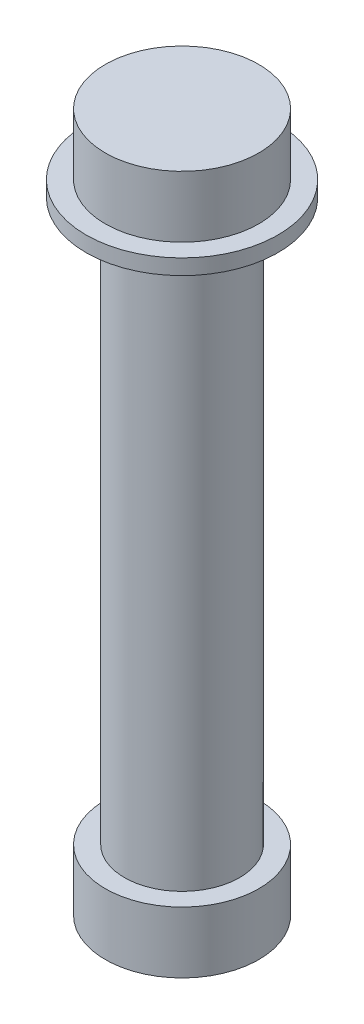
ISO-10303-21;
HEADER;
FILE_DESCRIPTION(('STEP AP214'),'2;1');
FILE_NAME('part.step','',(''),(''),'','','');
FILE_SCHEMA(('AUTOMOTIVE_DESIGN { 1 0 10303 214 1 1 1 1 }'));
ENDSEC;
DATA;
#1=APPLICATION_CONTEXT('core data for automotive mechanical design processes');
#2=APPLICATION_PROTOCOL_DEFINITION('international standard','automotive_design',2000,#1);
#3=PRODUCT_CONTEXT('',#1,'mechanical');
#4=PRODUCT('Part','Part','',(#3));
#5=PRODUCT_RELATED_PRODUCT_CATEGORY('part','',(#4));
#6=PRODUCT_DEFINITION_FORMATION('','',#4);
#7=PRODUCT_DEFINITION_CONTEXT('part definition',#1,'design');
#8=PRODUCT_DEFINITION('design','',#6,#7);
#9=PRODUCT_DEFINITION_SHAPE('','',#8);
#10=(LENGTH_UNIT() NAMED_UNIT(*) SI_UNIT(.MILLI.,.METRE.));
#11=(NAMED_UNIT(*) PLANE_ANGLE_UNIT() SI_UNIT($,.RADIAN.));
#12=(NAMED_UNIT(*) SI_UNIT($,.STERADIAN.) SOLID_ANGLE_UNIT());
#13=UNCERTAINTY_MEASURE_WITH_UNIT(LENGTH_MEASURE(1.E-05),#10,'distance_accuracy_value','');
#14=(GEOMETRIC_REPRESENTATION_CONTEXT(3) GLOBAL_UNCERTAINTY_ASSIGNED_CONTEXT((#13)) GLOBAL_UNIT_ASSIGNED_CONTEXT((#10,
#11,#12)) REPRESENTATION_CONTEXT('',''));
#15=CARTESIAN_POINT('',(0.,0.,0.));
#16=DIRECTION('',(0.,0.,1.));
#17=DIRECTION('',(1.,0.,0.));
#18=AXIS2_PLACEMENT_3D('',#15,#16,#17);
#19=CARTESIAN_POINT('',(0.,47.625,0.));
#20=DIRECTION('',(0.,1.,0.));
#21=DIRECTION('',(0.,0.,1.));
#22=AXIS2_PLACEMENT_3D('',#19,#20,#21);
#23=PLANE('',#22);
#24=CARTESIAN_POINT('',(0.,47.625,0.));
#25=DIRECTION('',(0.,1.,0.));
#26=DIRECTION('',(0.,0.,1.));
#27=AXIS2_PLACEMENT_3D('',#24,#25,#26);
#28=CIRCLE('',#27,7.9375);
#29=CARTESIAN_POINT('',(0.,47.625,7.9375));
#30=VERTEX_POINT('',#29);
#31=EDGE_CURVE('E38',#30,#30,#28,.T.);
#32=ORIENTED_EDGE('',*,*,#31,.T.);
#33=EDGE_LOOP('',(#32));
#34=FACE_BOUND('',#33,.T.);
#35=CARTESIAN_POINT('',(0.,47.625,0.));
#36=DIRECTION('',(0.,1.,0.));
#37=DIRECTION('',(0.,0.,1.));
#38=AXIS2_PLACEMENT_3D('',#35,#36,#37);
#39=CIRCLE('',#38,6.35);
#40=CARTESIAN_POINT('',(0.,47.625,6.35));
#41=VERTEX_POINT('',#40);
#42=EDGE_CURVE('E58',#41,#41,#39,.T.);
#43=ORIENTED_EDGE('',*,*,#42,.F.);
#44=EDGE_LOOP('',(#43));
#45=FACE_BOUND('',#44,.T.);
#46=ADVANCED_FACE('F31',(#34,#45),#23,.T.);
#47=CARTESIAN_POINT('',(0.,46.355,0.));
#48=DIRECTION('',(0.,-1.,0.));
#49=DIRECTION('',(0.,0.,-1.));
#50=AXIS2_PLACEMENT_3D('',#47,#48,#49);
#51=CYLINDRICAL_SURFACE('',#50,4.7625);
#52=CARTESIAN_POINT('',(0.,46.355,0.));
#53=DIRECTION('',(0.,1.,0.));
#54=DIRECTION('',(0.,0.,1.));
#55=AXIS2_PLACEMENT_3D('',#52,#53,#54);
#56=CIRCLE('',#55,4.7625);
#57=CARTESIAN_POINT('',(0.,46.355,-4.7625));
#58=VERTEX_POINT('',#57);
#59=EDGE_CURVE('E10',#58,#58,#56,.T.);
#60=CARTESIAN_POINT('',(0.,0.,0.));
#61=DIRECTION('',(0.,-1.,0.));
#62=DIRECTION('',(0.,0.,-1.));
#63=AXIS2_PLACEMENT_3D('',#60,#61,#62);
#64=CIRCLE('',#63,4.7625);
#65=CARTESIAN_POINT('',(0.,0.,-4.7625));
#66=VERTEX_POINT('',#65);
#67=EDGE_CURVE('E47',#66,#66,#64,.T.);
#68=CARTESIAN_POINT('',(0.,46.355,-4.7625));
#69=CARTESIAN_POINT('',(0.,45.8721354166667,-4.7625));
#70=CARTESIAN_POINT('',(0.,45.3892708333333,-4.7625));
#71=CARTESIAN_POINT('',(0.,44.4235416666667,-4.7625));
#72=CARTESIAN_POINT('',(0.,43.9406770833333,-4.7625));
#73=CARTESIAN_POINT('',(0.,42.9749479166667,-4.7625));
#74=CARTESIAN_POINT('',(0.,42.4920833333333,-4.7625));
#75=CARTESIAN_POINT('',(0.,41.5263541666667,-4.7625));
#76=CARTESIAN_POINT('',(0.,41.0434895833333,-4.7625));
#77=CARTESIAN_POINT('',(0.,40.0777604166667,-4.7625));
#78=CARTESIAN_POINT('',(0.,39.5948958333333,-4.7625));
#79=CARTESIAN_POINT('',(0.,38.6291666666667,-4.7625));
#80=CARTESIAN_POINT('',(0.,38.1463020833333,-4.7625));
#81=CARTESIAN_POINT('',(0.,37.1805729166667,-4.7625));
#82=CARTESIAN_POINT('',(0.,36.6977083333333,-4.7625));
#83=CARTESIAN_POINT('',(0.,35.7319791666667,-4.7625));
#84=CARTESIAN_POINT('',(0.,35.2491145833333,-4.7625));
#85=CARTESIAN_POINT('',(0.,34.2833854166667,-4.7625));
#86=CARTESIAN_POINT('',(0.,33.8005208333333,-4.7625));
#87=CARTESIAN_POINT('',(0.,32.8347916666667,-4.7625));
#88=CARTESIAN_POINT('',(0.,32.3519270833333,-4.7625));
#89=CARTESIAN_POINT('',(0.,31.3861979166667,-4.7625));
#90=CARTESIAN_POINT('',(0.,30.9033333333333,-4.7625));
#91=CARTESIAN_POINT('',(0.,29.9376041666667,-4.7625));
#92=CARTESIAN_POINT('',(0.,29.4547395833333,-4.7625));
#93=CARTESIAN_POINT('',(0.,28.4890104166667,-4.7625));
#94=CARTESIAN_POINT('',(0.,28.0061458333333,-4.7625));
#95=CARTESIAN_POINT('',(0.,27.0404166666667,-4.7625));
#96=CARTESIAN_POINT('',(0.,26.5575520833333,-4.7625));
#97=CARTESIAN_POINT('',(0.,25.5918229166667,-4.7625));
#98=CARTESIAN_POINT('',(0.,25.1089583333333,-4.7625));
#99=CARTESIAN_POINT('',(0.,24.1432291666667,-4.7625));
#100=CARTESIAN_POINT('',(0.,23.6603645833333,-4.7625));
#101=CARTESIAN_POINT('',(0.,22.6946354166667,-4.7625));
#102=CARTESIAN_POINT('',(0.,22.2117708333333,-4.7625));
#103=CARTESIAN_POINT('',(0.,21.2460416666667,-4.7625));
#104=CARTESIAN_POINT('',(0.,20.7631770833333,-4.7625));
#105=CARTESIAN_POINT('',(0.,19.7974479166667,-4.7625));
#106=CARTESIAN_POINT('',(0.,19.3145833333333,-4.7625));
#107=CARTESIAN_POINT('',(0.,18.3488541666667,-4.7625));
#108=CARTESIAN_POINT('',(0.,17.8659895833333,-4.7625));
#109=CARTESIAN_POINT('',(0.,16.9002604166667,-4.7625));
#110=CARTESIAN_POINT('',(0.,16.4173958333333,-4.7625));
#111=CARTESIAN_POINT('',(0.,15.4516666666667,-4.7625));
#112=CARTESIAN_POINT('',(0.,14.9688020833333,-4.7625));
#113=CARTESIAN_POINT('',(0.,14.0030729166667,-4.7625));
#114=CARTESIAN_POINT('',(0.,13.5202083333333,-4.7625));
#115=CARTESIAN_POINT('',(0.,12.5544791666667,-4.7625));
#116=CARTESIAN_POINT('',(0.,12.0716145833333,-4.7625));
#117=CARTESIAN_POINT('',(0.,11.1058854166667,-4.7625));
#118=CARTESIAN_POINT('',(0.,10.6230208333333,-4.7625));
#119=CARTESIAN_POINT('',(0.,9.65729166666666,-4.7625));
#120=CARTESIAN_POINT('',(0.,9.17442708333333,-4.7625));
#121=CARTESIAN_POINT('',(0.,8.20869791666667,-4.7625));
#122=CARTESIAN_POINT('',(0.,7.72583333333333,-4.7625));
#123=CARTESIAN_POINT('',(0.,6.76010416666667,-4.7625));
#124=CARTESIAN_POINT('',(0.,6.27723958333333,-4.7625));
#125=CARTESIAN_POINT('',(0.,5.31151041666666,-4.7625));
#126=CARTESIAN_POINT('',(0.,4.82864583333333,-4.7625));
#127=CARTESIAN_POINT('',(0.,3.86291666666667,-4.7625));
#128=CARTESIAN_POINT('',(0.,3.38005208333333,-4.7625));
#129=CARTESIAN_POINT('',(0.,2.41432291666667,-4.7625));
#130=CARTESIAN_POINT('',(0.,1.93145833333333,-4.7625));
#131=CARTESIAN_POINT('',(0.,0.965729166666665,-4.7625));
#132=CARTESIAN_POINT('',(0.,0.482864583333333,-4.7625));
#133=CARTESIAN_POINT('',(0.,0.,-4.7625));
#134=B_SPLINE_CURVE_WITH_KNOTS('',3,(#68,#69,#70,#71,#72,#73,#74,#75,#76,#77,#78,#79,#80,#81,
#82,#83,#84,#85,#86,#87,#88,#89,#90,#91,#92,#93,#94,#95,#96,#97,#98,#99,#100,#101,#102,#103,
#104,#105,#106,#107,#108,#109,#110,#111,#112,#113,#114,#115,#116,#117,#118,#119,#120,#121,#122,
#123,#124,#125,#126,#127,#128,#129,#130,#131,#132,#133),.UNSPECIFIED.,.F.,.F.,(4,2,2,2,2,2,2,2,
2,2,2,2,2,2,2,2,2,2,2,2,2,2,2,2,2,2,2,2,2,2,2,2,4),(0.,1.44859375,2.8971875,4.34578124999999,
5.794375,7.24296874999999,8.69156249999999,10.14015625,11.58875,13.03734375,14.4859375,
15.93453125,17.383125,18.83171875,20.2803125,21.72890625,23.1775,24.62609375,26.0746875,
27.52328125,28.971875,30.42046875,31.8690625,33.31765625,34.76625,36.21484375,37.6634375,
39.11203125,40.560625,42.00921875,43.4578125,44.90640625,46.355),.UNSPECIFIED.);
#135=EDGE_CURVE('BSEAM33',#58,#66,#134,.T.);
#136=ORIENTED_EDGE('',*,*,#59,.F.);
#137=ORIENTED_EDGE('',*,*,#67,.F.);
#138=ORIENTED_EDGE('',*,*,#135,.T.);
#139=ORIENTED_EDGE('',*,*,#135,.F.);
#140=EDGE_LOOP('',(#136,#138,#137,#139));
#141=FACE_BOUND('',#140,.T.);
#142=ADVANCED_FACE('F33',(#141),#51,.T.);
#143=CARTESIAN_POINT('',(0.,46.355,0.));
#144=DIRECTION('',(0.,1.,0.));
#145=DIRECTION('',(0.,0.,1.));
#146=AXIS2_PLACEMENT_3D('',#143,#144,#145);
#147=PLANE('',#146);
#148=CARTESIAN_POINT('',(0.,46.355,0.));
#149=DIRECTION('',(0.,1.,0.));
#150=DIRECTION('',(0.,0.,1.));
#151=AXIS2_PLACEMENT_3D('',#148,#149,#150);
#152=CIRCLE('',#151,7.9375);
#153=CARTESIAN_POINT('',(0.,46.355,7.9375));
#154=VERTEX_POINT('',#153);
#155=EDGE_CURVE('E42',#154,#154,#152,.T.);
#156=ORIENTED_EDGE('',*,*,#155,.F.);
#157=EDGE_LOOP('',(#156));
#158=FACE_BOUND('',#157,.T.);
#159=ORIENTED_EDGE('',*,*,#59,.T.);
#160=EDGE_LOOP('',(#159));
#161=FACE_BOUND('',#160,.T.);
#162=ADVANCED_FACE('F78',(#158,#161),#147,.F.);
#163=CARTESIAN_POINT('',(0.,47.625,0.));
#164=DIRECTION('',(0.,-1.,0.));
#165=DIRECTION('',(0.,0.,-1.));
#166=AXIS2_PLACEMENT_3D('',#163,#164,#165);
#167=CYLINDRICAL_SURFACE('',#166,7.9375);
#168=ORIENTED_EDGE('',*,*,#31,.F.);
#169=EDGE_LOOP('',(#168));
#170=FACE_BOUND('',#169,.T.);
#171=ORIENTED_EDGE('',*,*,#155,.T.);
#172=EDGE_LOOP('',(#171));
#173=FACE_BOUND('',#172,.T.);
#174=ADVANCED_FACE('F85',(#170,#173),#167,.T.);
#175=CARTESIAN_POINT('',(0.,0.,0.));
#176=DIRECTION('',(0.,-1.,0.));
#177=DIRECTION('',(0.,0.,-1.));
#178=AXIS2_PLACEMENT_3D('',#175,#176,#177);
#179=PLANE('',#178);
#180=CARTESIAN_POINT('',(0.,0.,0.));
#181=DIRECTION('',(0.,-1.,0.));
#182=DIRECTION('',(0.,0.,-1.));
#183=AXIS2_PLACEMENT_3D('',#180,#181,#182);
#184=CIRCLE('',#183,6.35);
#185=CARTESIAN_POINT('',(0.,0.,-6.35));
#186=VERTEX_POINT('',#185);
#187=EDGE_CURVE('E52',#186,#186,#184,.T.);
#188=ORIENTED_EDGE('',*,*,#187,.F.);
#189=EDGE_LOOP('',(#188));
#190=FACE_BOUND('',#189,.T.);
#191=ORIENTED_EDGE('',*,*,#67,.T.);
#192=EDGE_LOOP('',(#191));
#193=FACE_BOUND('',#192,.T.);
#194=ADVANCED_FACE('F88',(#190,#193),#179,.F.);
#195=CARTESIAN_POINT('',(0.,-5.08,0.));
#196=DIRECTION('',(0.,1.,0.));
#197=DIRECTION('',(0.,0.,1.));
#198=AXIS2_PLACEMENT_3D('',#195,#196,#197);
#199=CYLINDRICAL_SURFACE('',#198,6.35);
#200=CARTESIAN_POINT('',(0.,-5.08,0.));
#201=DIRECTION('',(0.,-1.,0.));
#202=DIRECTION('',(0.,0.,-1.));
#203=AXIS2_PLACEMENT_3D('',#200,#201,#202);
#204=CIRCLE('',#203,6.35);
#205=CARTESIAN_POINT('',(0.,-5.08,-6.35));
#206=VERTEX_POINT('',#205);
#207=EDGE_CURVE('E51',#206,#206,#204,.T.);
#208=ORIENTED_EDGE('',*,*,#207,.F.);
#209=EDGE_LOOP('',(#208));
#210=FACE_BOUND('',#209,.T.);
#211=ORIENTED_EDGE('',*,*,#187,.T.);
#212=EDGE_LOOP('',(#211));
#213=FACE_BOUND('',#212,.T.);
#214=ADVANCED_FACE('F82',(#210,#213),#199,.T.);
#215=CARTESIAN_POINT('',(0.,-5.08,0.));
#216=DIRECTION('',(0.,-1.,0.));
#217=DIRECTION('',(0.,0.,-1.));
#218=AXIS2_PLACEMENT_3D('',#215,#216,#217);
#219=PLANE('',#218);
#220=ORIENTED_EDGE('',*,*,#207,.T.);
#221=EDGE_LOOP('',(#220));
#222=FACE_BOUND('',#221,.T.);
#223=ADVANCED_FACE('F69',(#222),#219,.T.);
#224=CARTESIAN_POINT('',(0.,52.705,0.));
#225=DIRECTION('',(0.,-1.,0.));
#226=DIRECTION('',(0.,0.,-1.));
#227=AXIS2_PLACEMENT_3D('',#224,#225,#226);
#228=CYLINDRICAL_SURFACE('',#227,6.35);
#229=CARTESIAN_POINT('',(0.,52.705,0.));
#230=DIRECTION('',(0.,1.,0.));
#231=DIRECTION('',(0.,0.,1.));
#232=AXIS2_PLACEMENT_3D('',#229,#230,#231);
#233=CIRCLE('',#232,6.35);
#234=CARTESIAN_POINT('',(0.,52.705,6.35));
#235=VERTEX_POINT('',#234);
#236=EDGE_CURVE('E55',#235,#235,#233,.T.);
#237=ORIENTED_EDGE('',*,*,#236,.F.);
#238=EDGE_LOOP('',(#237));
#239=FACE_BOUND('',#238,.T.);
#240=ORIENTED_EDGE('',*,*,#42,.T.);
#241=EDGE_LOOP('',(#240));
#242=FACE_BOUND('',#241,.T.);
#243=ADVANCED_FACE('F66',(#239,#242),#228,.T.);
#244=CARTESIAN_POINT('',(0.,52.705,0.));
#245=DIRECTION('',(0.,1.,0.));
#246=DIRECTION('',(0.,0.,1.));
#247=AXIS2_PLACEMENT_3D('',#244,#245,#246);
#248=PLANE('',#247);
#249=ORIENTED_EDGE('',*,*,#236,.T.);
#250=EDGE_LOOP('',(#249));
#251=FACE_BOUND('',#250,.T.);
#252=ADVANCED_FACE('F64',(#251),#248,.T.);
#253=CLOSED_SHELL('',(#46,#142,#162,#174,#194,#214,#223,#243,#252));
#254=MANIFOLD_SOLID_BREP('B2',#253);
#255=ADVANCED_BREP_SHAPE_REPRESENTATION('',(#18,#254),#14);
#256=SHAPE_DEFINITION_REPRESENTATION(#9,#255);
ENDSEC;
END-ISO-10303-21;
